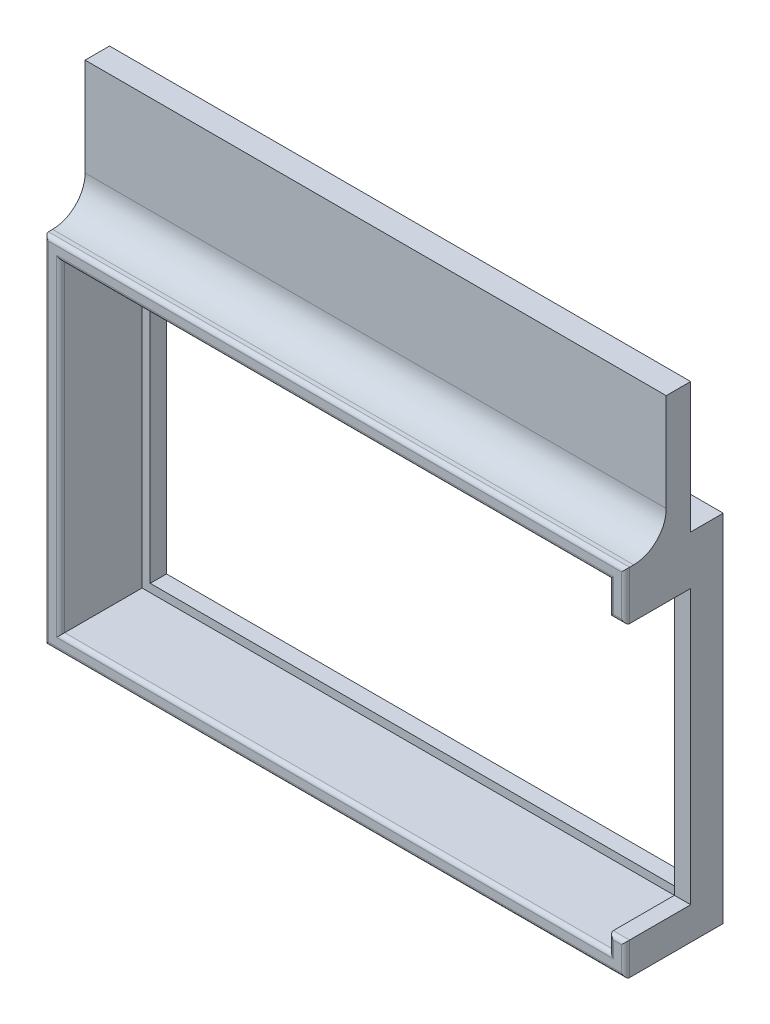
ISO-10303-21;
HEADER;
FILE_DESCRIPTION(('STEP AP214'),'2;1');
FILE_NAME('part.step','',(''),(''),'','','');
FILE_SCHEMA(('AUTOMOTIVE_DESIGN { 1 0 10303 214 1 1 1 1 }'));
ENDSEC;
DATA;
#1=APPLICATION_CONTEXT('core data for automotive mechanical design processes');
#2=APPLICATION_PROTOCOL_DEFINITION('international standard','automotive_design',2000,#1);
#3=PRODUCT_CONTEXT('',#1,'mechanical');
#4=PRODUCT('Part','Part','',(#3));
#5=PRODUCT_RELATED_PRODUCT_CATEGORY('part','',(#4));
#6=PRODUCT_DEFINITION_FORMATION('','',#4);
#7=PRODUCT_DEFINITION_CONTEXT('part definition',#1,'design');
#8=PRODUCT_DEFINITION('design','',#6,#7);
#9=PRODUCT_DEFINITION_SHAPE('','',#8);
#10=(LENGTH_UNIT() NAMED_UNIT(*) SI_UNIT(.MILLI.,.METRE.));
#11=(NAMED_UNIT(*) PLANE_ANGLE_UNIT() SI_UNIT($,.RADIAN.));
#12=(NAMED_UNIT(*) SI_UNIT($,.STERADIAN.) SOLID_ANGLE_UNIT());
#13=UNCERTAINTY_MEASURE_WITH_UNIT(LENGTH_MEASURE(1.E-05),#10,'distance_accuracy_value','');
#14=(GEOMETRIC_REPRESENTATION_CONTEXT(3) GLOBAL_UNCERTAINTY_ASSIGNED_CONTEXT((#13)) GLOBAL_UNIT_ASSIGNED_CONTEXT((#10,
#11,#12)) REPRESENTATION_CONTEXT('',''));
#15=CARTESIAN_POINT('',(0.,0.,0.));
#16=DIRECTION('',(0.,0.,1.));
#17=DIRECTION('',(1.,0.,0.));
#18=AXIS2_PLACEMENT_3D('',#15,#16,#17);
#19=CARTESIAN_POINT('',(0.,29.82,2.));
#20=DIRECTION('',(0.,1.,0.));
#21=DIRECTION('',(0.,0.,1.));
#22=AXIS2_PLACEMENT_3D('',#19,#20,#21);
#23=PLANE('',#22);
#24=DIRECTION('',(0.,0.,1.));
#25=VECTOR('',#24,1.);
#26=CARTESIAN_POINT('',(0.,29.82,2.));
#27=LINE('',#26,#25);
#28=CARTESIAN_POINT('',(0.,29.82,2.));
#29=VERTEX_POINT('',#28);
#30=CARTESIAN_POINT('',(0.,29.82,3.5));
#31=VERTEX_POINT('',#30);
#32=EDGE_CURVE('E226',#29,#31,#27,.T.);
#33=ORIENTED_EDGE('',*,*,#32,.T.);
#34=DIRECTION('',(-1.,0.,0.));
#35=VECTOR('',#34,1.);
#36=CARTESIAN_POINT('',(0.,29.82,3.5));
#37=LINE('',#36,#35);
#38=CARTESIAN_POINT('',(35.68,29.82,3.5));
#39=VERTEX_POINT('',#38);
#40=EDGE_CURVE('E210',#39,#31,#37,.T.);
#41=ORIENTED_EDGE('',*,*,#40,.F.);
#42=DIRECTION('',(0.,0.,1.));
#43=VECTOR('',#42,1.);
#44=CARTESIAN_POINT('',(35.68,29.82,2.));
#45=LINE('',#44,#43);
#46=CARTESIAN_POINT('',(35.68,29.82,2.));
#47=VERTEX_POINT('',#46);
#48=EDGE_CURVE('E235',#47,#39,#45,.T.);
#49=ORIENTED_EDGE('',*,*,#48,.F.);
#50=DIRECTION('',(-1.,0.,0.));
#51=VECTOR('',#50,1.);
#52=CARTESIAN_POINT('',(0.,29.82,2.));
#53=LINE('',#52,#51);
#54=EDGE_CURVE('E233',#47,#29,#53,.T.);
#55=ORIENTED_EDGE('',*,*,#54,.T.);
#56=EDGE_LOOP('',(#33,#41,#49,#55));
#57=FACE_BOUND('',#56,.T.);
#58=ADVANCED_FACE('F33',(#57),#23,.T.);
#59=CARTESIAN_POINT('',(0.,0.,1.));
#60=DIRECTION('',(0.,0.,-1.));
#61=DIRECTION('',(-1.,0.,0.));
#62=AXIS2_PLACEMENT_3D('',#59,#60,#61);
#63=PLANE('',#62);
#64=DIRECTION('',(0.,-1.,0.));
#65=VECTOR('',#64,1.);
#66=CARTESIAN_POINT('',(1.,1.,1.));
#67=LINE('',#66,#65);
#68=CARTESIAN_POINT('',(1.,20.82,1.));
#69=VERTEX_POINT('',#68);
#70=CARTESIAN_POINT('',(1.,1.,1.));
#71=VERTEX_POINT('',#70);
#72=EDGE_CURVE('E279',#69,#71,#67,.T.);
#73=ORIENTED_EDGE('',*,*,#72,.T.);
#74=DIRECTION('',(1.,0.,0.));
#75=VECTOR('',#74,1.);
#76=CARTESIAN_POINT('',(1.,1.,1.));
#77=LINE('',#76,#75);
#78=CARTESIAN_POINT('',(34.68,1.,1.));
#79=VERTEX_POINT('',#78);
#80=EDGE_CURVE('E288',#71,#79,#77,.T.);
#81=ORIENTED_EDGE('',*,*,#80,.T.);
#82=DIRECTION('',(0.,1.,0.));
#83=VECTOR('',#82,1.);
#84=CARTESIAN_POINT('',(34.68,1.,1.));
#85=LINE('',#84,#83);
#86=CARTESIAN_POINT('',(34.68,20.82,1.));
#87=VERTEX_POINT('',#86);
#88=EDGE_CURVE('E291',#79,#87,#85,.T.);
#89=ORIENTED_EDGE('',*,*,#88,.T.);
#90=DIRECTION('',(-1.,0.,0.));
#91=VECTOR('',#90,1.);
#92=CARTESIAN_POINT('',(1.,20.82,1.));
#93=LINE('',#92,#91);
#94=EDGE_CURVE('E294',#87,#69,#93,.T.);
#95=ORIENTED_EDGE('',*,*,#94,.T.);
#96=EDGE_LOOP('',(#73,#81,#89,#95));
#97=FACE_BOUND('',#96,.T.);
#98=DIRECTION('',(0.,-1.,0.));
#99=VECTOR('',#98,1.);
#100=CARTESIAN_POINT('',(1.5,1.5,1.));
#101=LINE('',#100,#99);
#102=CARTESIAN_POINT('',(1.5,20.32,1.));
#103=VERTEX_POINT('',#102);
#104=CARTESIAN_POINT('',(1.5,1.5,1.));
#105=VERTEX_POINT('',#104);
#106=EDGE_CURVE('E251',#103,#105,#101,.T.);
#107=ORIENTED_EDGE('',*,*,#106,.F.);
#108=DIRECTION('',(-1.,0.,0.));
#109=VECTOR('',#108,1.);
#110=CARTESIAN_POINT('',(1.5,20.32,1.));
#111=LINE('',#110,#109);
#112=CARTESIAN_POINT('',(34.18,20.32,1.));
#113=VERTEX_POINT('',#112);
#114=EDGE_CURVE('E258',#113,#103,#111,.T.);
#115=ORIENTED_EDGE('',*,*,#114,.F.);
#116=DIRECTION('',(0.,1.,0.));
#117=VECTOR('',#116,1.);
#118=CARTESIAN_POINT('',(34.18,1.5,1.));
#119=LINE('',#118,#117);
#120=CARTESIAN_POINT('',(34.18,1.5,1.));
#121=VERTEX_POINT('',#120);
#122=EDGE_CURVE('E273',#121,#113,#119,.T.);
#123=ORIENTED_EDGE('',*,*,#122,.F.);
#124=DIRECTION('',(1.,0.,0.));
#125=VECTOR('',#124,1.);
#126=CARTESIAN_POINT('',(1.5,1.5,1.));
#127=LINE('',#126,#125);
#128=EDGE_CURVE('E270',#105,#121,#127,.T.);
#129=ORIENTED_EDGE('',*,*,#128,.F.);
#130=EDGE_LOOP('',(#107,#115,#123,#129));
#131=FACE_BOUND('',#130,.T.);
#132=ADVANCED_FACE('F477',(#97,#131),#63,.F.);
#133=CARTESIAN_POINT('',(0.,0.,6.));
#134=DIRECTION('',(1.,0.,0.));
#135=DIRECTION('',(0.,0.,-1.));
#136=AXIS2_PLACEMENT_3D('',#133,#134,#135);
#137=PLANE('',#136);
#138=DIRECTION('',(0.,0.,-1.));
#139=VECTOR('',#138,1.);
#140=CARTESIAN_POINT('',(0.,0.,6.));
#141=LINE('',#140,#139);
#142=CARTESIAN_POINT('',(0.,0.,5.75));
#143=VERTEX_POINT('',#142);
#144=CARTESIAN_POINT('',(0.,0.,0.));
#145=VERTEX_POINT('',#144);
#146=EDGE_CURVE('E327',#143,#145,#141,.T.);
#147=ORIENTED_EDGE('',*,*,#146,.F.);
#148=DIRECTION('',(0.,-1.,0.));
#149=VECTOR('',#148,1.);
#150=CARTESIAN_POINT('',(0.,0.,5.75));
#151=LINE('',#150,#149);
#152=CARTESIAN_POINT('',(0.,21.82,5.75));
#153=VERTEX_POINT('',#152);
#154=EDGE_CURVE('E383',#143,#153,#151,.F.);
#155=ORIENTED_EDGE('',*,*,#154,.T.);
#156=DIRECTION('',(0.,0.,1.));
#157=VECTOR('',#156,1.);
#158=CARTESIAN_POINT('',(0.,21.82,3.5));
#159=LINE('',#158,#157);
#160=CARTESIAN_POINT('',(0.,21.82,5.5));
#161=VERTEX_POINT('',#160);
#162=EDGE_CURVE('E220',#161,#153,#159,.T.);
#163=ORIENTED_EDGE('',*,*,#162,.F.);
#164=CARTESIAN_POINT('',(0.,23.82,5.5));
#165=DIRECTION('',(1.,0.,0.));
#166=DIRECTION('',(0.,0.,-1.));
#167=AXIS2_PLACEMENT_3D('',#164,#165,#166);
#168=CIRCLE('',#167,2.);
#169=CARTESIAN_POINT('',(0.,23.82,3.5));
#170=VERTEX_POINT('',#169);
#171=EDGE_CURVE('E11',#161,#170,#168,.T.);
#172=ORIENTED_EDGE('',*,*,#171,.T.);
#173=DIRECTION('',(0.,-1.,0.));
#174=VECTOR('',#173,1.);
#175=CARTESIAN_POINT('',(0.,29.82,3.5));
#176=LINE('',#175,#174);
#177=EDGE_CURVE('E214',#31,#170,#176,.T.);
#178=ORIENTED_EDGE('',*,*,#177,.F.);
#179=ORIENTED_EDGE('',*,*,#32,.F.);
#180=DIRECTION('',(0.,-1.,0.));
#181=VECTOR('',#180,1.);
#182=CARTESIAN_POINT('',(0.,21.82,2.));
#183=LINE('',#182,#181);
#184=CARTESIAN_POINT('',(0.,21.82,2.));
#185=VERTEX_POINT('',#184);
#186=EDGE_CURVE('E432',#29,#185,#183,.T.);
#187=ORIENTED_EDGE('',*,*,#186,.T.);
#188=DIRECTION('',(0.,0.,-1.));
#189=VECTOR('',#188,1.);
#190=CARTESIAN_POINT('',(0.,21.82,6.));
#191=LINE('',#190,#189);
#192=CARTESIAN_POINT('',(0.,21.82,0.));
#193=VERTEX_POINT('',#192);
#194=EDGE_CURVE('E321',#185,#193,#191,.T.);
#195=ORIENTED_EDGE('',*,*,#194,.T.);
#196=DIRECTION('',(0.,-1.,0.));
#197=VECTOR('',#196,1.);
#198=CARTESIAN_POINT('',(0.,0.,0.));
#199=LINE('',#198,#197);
#200=EDGE_CURVE('E301',#193,#145,#199,.T.);
#201=ORIENTED_EDGE('',*,*,#200,.T.);
#202=EDGE_LOOP('',(#147,#155,#163,#172,#178,#179,#187,#195,#201));
#203=FACE_BOUND('',#202,.T.);
#204=ADVANCED_FACE('F224',(#203),#137,.F.);
#205=CARTESIAN_POINT('',(0.,0.,6.));
#206=DIRECTION('',(0.,1.,0.));
#207=DIRECTION('',(0.,0.,1.));
#208=AXIS2_PLACEMENT_3D('',#205,#206,#207);
#209=PLANE('',#208);
#210=DIRECTION('',(0.,0.,-1.));
#211=VECTOR('',#210,1.);
#212=CARTESIAN_POINT('',(35.68,0.,6.));
#213=LINE('',#212,#211);
#214=CARTESIAN_POINT('',(35.68,0.,5.75));
#215=VERTEX_POINT('',#214);
#216=CARTESIAN_POINT('',(35.68,0.,0.));
#217=VERTEX_POINT('',#216);
#218=EDGE_CURVE('E325',#215,#217,#213,.T.);
#219=ORIENTED_EDGE('',*,*,#218,.F.);
#220=DIRECTION('',(1.,0.,0.));
#221=VECTOR('',#220,1.);
#222=CARTESIAN_POINT('',(0.,0.,5.75));
#223=LINE('',#222,#221);
#224=EDGE_CURVE('E381',#215,#143,#223,.F.);
#225=ORIENTED_EDGE('',*,*,#224,.T.);
#226=ORIENTED_EDGE('',*,*,#146,.T.);
#227=DIRECTION('',(1.,0.,0.));
#228=VECTOR('',#227,1.);
#229=CARTESIAN_POINT('',(0.,0.,0.));
#230=LINE('',#229,#228);
#231=EDGE_CURVE('E312',#145,#217,#230,.T.);
#232=ORIENTED_EDGE('',*,*,#231,.T.);
#233=EDGE_LOOP('',(#219,#225,#226,#232));
#234=FACE_BOUND('',#233,.T.);
#235=ADVANCED_FACE('F544',(#234),#209,.F.);
#236=CARTESIAN_POINT('',(35.68,0.,6.));
#237=DIRECTION('',(-1.,0.,0.));
#238=DIRECTION('',(0.,0.,1.));
#239=AXIS2_PLACEMENT_3D('',#236,#237,#238);
#240=PLANE('',#239);
#241=DIRECTION('',(0.,0.,-1.));
#242=VECTOR('',#241,1.);
#243=CARTESIAN_POINT('',(35.68,2.,6.));
#244=LINE('',#243,#242);
#245=CARTESIAN_POINT('',(35.68,2.,5.75));
#246=VERTEX_POINT('',#245);
#247=CARTESIAN_POINT('',(35.68,2.,2.));
#248=VERTEX_POINT('',#247);
#249=EDGE_CURVE('E234',#246,#248,#244,.T.);
#250=ORIENTED_EDGE('',*,*,#249,.F.);
#251=DIRECTION('',(0.,1.,0.));
#252=VECTOR('',#251,1.);
#253=CARTESIAN_POINT('',(35.68,0.,5.75));
#254=LINE('',#253,#252);
#255=EDGE_CURVE('E379',#246,#215,#254,.F.);
#256=ORIENTED_EDGE('',*,*,#255,.T.);
#257=ORIENTED_EDGE('',*,*,#218,.T.);
#258=DIRECTION('',(0.,1.,0.));
#259=VECTOR('',#258,1.);
#260=CARTESIAN_POINT('',(35.68,0.,0.));
#261=LINE('',#260,#259);
#262=CARTESIAN_POINT('',(35.68,21.82,0.));
#263=VERTEX_POINT('',#262);
#264=EDGE_CURVE('E315',#217,#263,#261,.T.);
#265=ORIENTED_EDGE('',*,*,#264,.T.);
#266=DIRECTION('',(0.,0.,-1.));
#267=VECTOR('',#266,1.);
#268=CARTESIAN_POINT('',(35.68,21.82,6.));
#269=LINE('',#268,#267);
#270=CARTESIAN_POINT('',(35.68,21.82,2.));
#271=VERTEX_POINT('',#270);
#272=EDGE_CURVE('E323',#271,#263,#269,.T.);
#273=ORIENTED_EDGE('',*,*,#272,.F.);
#274=DIRECTION('',(0.,1.,0.));
#275=VECTOR('',#274,1.);
#276=CARTESIAN_POINT('',(35.68,21.82,2.));
#277=LINE('',#276,#275);
#278=EDGE_CURVE('E437',#271,#47,#277,.T.);
#279=ORIENTED_EDGE('',*,*,#278,.T.);
#280=ORIENTED_EDGE('',*,*,#48,.T.);
#281=DIRECTION('',(0.,1.,0.));
#282=VECTOR('',#281,1.);
#283=CARTESIAN_POINT('',(35.68,29.82,3.5));
#284=LINE('',#283,#282);
#285=CARTESIAN_POINT('',(35.68,23.82,3.5));
#286=VERTEX_POINT('',#285);
#287=EDGE_CURVE('E216',#286,#39,#284,.T.);
#288=ORIENTED_EDGE('',*,*,#287,.F.);
#289=CARTESIAN_POINT('',(35.68,23.82,5.5));
#290=DIRECTION('',(-1.,0.,0.));
#291=DIRECTION('',(0.,0.,1.));
#292=AXIS2_PLACEMENT_3D('',#289,#290,#291);
#293=CIRCLE('',#292,2.);
#294=CARTESIAN_POINT('',(35.68,21.82,5.5));
#295=VERTEX_POINT('',#294);
#296=EDGE_CURVE('E41',#286,#295,#293,.T.);
#297=ORIENTED_EDGE('',*,*,#296,.T.);
#298=DIRECTION('',(0.,0.,1.));
#299=VECTOR('',#298,1.);
#300=CARTESIAN_POINT('',(35.68,21.82,3.5));
#301=LINE('',#300,#299);
#302=CARTESIAN_POINT('',(35.68,21.82,5.75));
#303=VERTEX_POINT('',#302);
#304=EDGE_CURVE('E430',#295,#303,#301,.T.);
#305=ORIENTED_EDGE('',*,*,#304,.T.);
#306=DIRECTION('',(0.,1.,0.));
#307=VECTOR('',#306,1.);
#308=CARTESIAN_POINT('',(35.68,0.,5.75));
#309=LINE('',#308,#307);
#310=CARTESIAN_POINT('',(35.68,18.82,5.75));
#311=VERTEX_POINT('',#310);
#312=EDGE_CURVE('E377',#303,#311,#309,.F.);
#313=ORIENTED_EDGE('',*,*,#312,.T.);
#314=DIRECTION('',(0.,0.,1.));
#315=VECTOR('',#314,1.);
#316=CARTESIAN_POINT('',(35.68,18.82,6.));
#317=LINE('',#316,#315);
#318=CARTESIAN_POINT('',(35.68,18.82,2.));
#319=VERTEX_POINT('',#318);
#320=EDGE_CURVE('E245',#319,#311,#317,.T.);
#321=ORIENTED_EDGE('',*,*,#320,.F.);
#322=DIRECTION('',(0.,1.,0.));
#323=VECTOR('',#322,1.);
#324=CARTESIAN_POINT('',(35.68,18.82,2.));
#325=LINE('',#324,#323);
#326=EDGE_CURVE('E237',#248,#319,#325,.T.);
#327=ORIENTED_EDGE('',*,*,#326,.F.);
#328=EDGE_LOOP('',(#250,#256,#257,#265,#273,#279,#280,#288,#297,#305,#313,#321,#327));
#329=FACE_BOUND('',#328,.T.);
#330=ADVANCED_FACE('F426',(#329),#240,.F.);
#331=CARTESIAN_POINT('',(0.,21.82,6.));
#332=DIRECTION('',(0.,-1.,0.));
#333=DIRECTION('',(0.,0.,-1.));
#334=AXIS2_PLACEMENT_3D('',#331,#332,#333);
#335=PLANE('',#334);
#336=ORIENTED_EDGE('',*,*,#194,.F.);
#337=DIRECTION('',(1.,0.,0.));
#338=VECTOR('',#337,1.);
#339=CARTESIAN_POINT('',(0.,21.82,2.));
#340=LINE('',#339,#338);
#341=EDGE_CURVE('E435',#185,#271,#340,.T.);
#342=ORIENTED_EDGE('',*,*,#341,.T.);
#343=ORIENTED_EDGE('',*,*,#272,.T.);
#344=DIRECTION('',(-1.,0.,0.));
#345=VECTOR('',#344,1.);
#346=CARTESIAN_POINT('',(0.,21.82,0.));
#347=LINE('',#346,#345);
#348=EDGE_CURVE('E318',#263,#193,#347,.T.);
#349=ORIENTED_EDGE('',*,*,#348,.T.);
#350=EDGE_LOOP('',(#336,#342,#343,#349));
#351=FACE_BOUND('',#350,.T.);
#352=ADVANCED_FACE('F443',(#351),#335,.F.);
#353=CARTESIAN_POINT('',(0.,0.,6.));
#354=DIRECTION('',(0.,0.,-1.));
#355=DIRECTION('',(-1.,0.,0.));
#356=AXIS2_PLACEMENT_3D('',#353,#354,#355);
#357=PLANE('',#356);
#358=DIRECTION('',(0.,1.,0.));
#359=VECTOR('',#358,1.);
#360=CARTESIAN_POINT('',(34.93,0.,6.));
#361=LINE('',#360,#359);
#362=CARTESIAN_POINT('',(34.93,21.07,6.));
#363=VERTEX_POINT('',#362);
#364=CARTESIAN_POINT('',(34.93,19.07,6.));
#365=VERTEX_POINT('',#364);
#366=EDGE_CURVE('E357',#363,#365,#361,.F.);
#367=ORIENTED_EDGE('',*,*,#366,.T.);
#368=DIRECTION('',(1.,0.,0.));
#369=VECTOR('',#368,1.);
#370=CARTESIAN_POINT('',(0.,19.07,6.));
#371=LINE('',#370,#369);
#372=CARTESIAN_POINT('',(35.43,19.07,6.));
#373=VERTEX_POINT('',#372);
#374=EDGE_CURVE('E359',#365,#373,#371,.T.);
#375=ORIENTED_EDGE('',*,*,#374,.T.);
#376=DIRECTION('',(0.,1.,0.));
#377=VECTOR('',#376,1.);
#378=CARTESIAN_POINT('',(35.43,0.,6.));
#379=LINE('',#378,#377);
#380=CARTESIAN_POINT('',(35.43,21.57,6.));
#381=VERTEX_POINT('',#380);
#382=EDGE_CURVE('E337',#373,#381,#379,.T.);
#383=ORIENTED_EDGE('',*,*,#382,.T.);
#384=DIRECTION('',(1.,0.,0.));
#385=VECTOR('',#384,1.);
#386=CARTESIAN_POINT('',(0.,21.57,6.));
#387=LINE('',#386,#385);
#388=CARTESIAN_POINT('',(0.25,21.57,6.));
#389=VERTEX_POINT('',#388);
#390=EDGE_CURVE('E339',#381,#389,#387,.F.);
#391=ORIENTED_EDGE('',*,*,#390,.T.);
#392=DIRECTION('',(0.,-1.,0.));
#393=VECTOR('',#392,1.);
#394=CARTESIAN_POINT('',(0.25,0.,6.));
#395=LINE('',#394,#393);
#396=CARTESIAN_POINT('',(0.25,0.25,6.));
#397=VERTEX_POINT('',#396);
#398=EDGE_CURVE('E341',#389,#397,#395,.T.);
#399=ORIENTED_EDGE('',*,*,#398,.T.);
#400=DIRECTION('',(1.,0.,0.));
#401=VECTOR('',#400,1.);
#402=CARTESIAN_POINT('',(0.,0.25,6.));
#403=LINE('',#402,#401);
#404=CARTESIAN_POINT('',(35.43,0.25,6.));
#405=VERTEX_POINT('',#404);
#406=EDGE_CURVE('E343',#397,#405,#403,.T.);
#407=ORIENTED_EDGE('',*,*,#406,.T.);
#408=DIRECTION('',(0.,1.,0.));
#409=VECTOR('',#408,1.);
#410=CARTESIAN_POINT('',(35.43,0.,6.));
#411=LINE('',#410,#409);
#412=CARTESIAN_POINT('',(35.43,1.75,6.));
#413=VERTEX_POINT('',#412);
#414=EDGE_CURVE('E345',#405,#413,#411,.T.);
#415=ORIENTED_EDGE('',*,*,#414,.T.);
#416=DIRECTION('',(1.,0.,0.));
#417=VECTOR('',#416,1.);
#418=CARTESIAN_POINT('',(0.,1.75,6.));
#419=LINE('',#418,#417);
#420=CARTESIAN_POINT('',(34.93,1.75,6.));
#421=VERTEX_POINT('',#420);
#422=EDGE_CURVE('E347',#413,#421,#419,.F.);
#423=ORIENTED_EDGE('',*,*,#422,.T.);
#424=DIRECTION('',(0.,1.,0.));
#425=VECTOR('',#424,1.);
#426=CARTESIAN_POINT('',(34.93,0.,6.));
#427=LINE('',#426,#425);
#428=CARTESIAN_POINT('',(34.93,0.75,6.));
#429=VERTEX_POINT('',#428);
#430=EDGE_CURVE('E349',#421,#429,#427,.F.);
#431=ORIENTED_EDGE('',*,*,#430,.T.);
#432=DIRECTION('',(1.,0.,0.));
#433=VECTOR('',#432,1.);
#434=CARTESIAN_POINT('',(0.,0.75,6.));
#435=LINE('',#434,#433);
#436=CARTESIAN_POINT('',(0.75,0.75,6.));
#437=VERTEX_POINT('',#436);
#438=EDGE_CURVE('E351',#429,#437,#435,.F.);
#439=ORIENTED_EDGE('',*,*,#438,.T.);
#440=DIRECTION('',(0.,-1.,0.));
#441=VECTOR('',#440,1.);
#442=CARTESIAN_POINT('',(0.75,0.,6.));
#443=LINE('',#442,#441);
#444=CARTESIAN_POINT('',(0.75,21.07,6.));
#445=VERTEX_POINT('',#444);
#446=EDGE_CURVE('E353',#437,#445,#443,.F.);
#447=ORIENTED_EDGE('',*,*,#446,.T.);
#448=DIRECTION('',(-1.,0.,0.));
#449=VECTOR('',#448,1.);
#450=CARTESIAN_POINT('',(0.,21.07,6.));
#451=LINE('',#450,#449);
#452=EDGE_CURVE('E355',#445,#363,#451,.F.);
#453=ORIENTED_EDGE('',*,*,#452,.T.);
#454=EDGE_LOOP('',(#367,#375,#383,#391,#399,#407,#415,#423,#431,#439,#447,#453));
#455=FACE_BOUND('',#454,.T.);
#456=ADVANCED_FACE('F533',(#455),#357,.F.);
#457=CARTESIAN_POINT('',(0.,0.,0.));
#458=DIRECTION('',(0.,0.,-1.));
#459=DIRECTION('',(-1.,0.,0.));
#460=AXIS2_PLACEMENT_3D('',#457,#458,#459);
#461=PLANE('',#460);
#462=DIRECTION('',(0.,-1.,0.));
#463=VECTOR('',#462,1.);
#464=CARTESIAN_POINT('',(1.5,1.5,0.));
#465=LINE('',#464,#463);
#466=CARTESIAN_POINT('',(1.5,20.32,0.));
#467=VERTEX_POINT('',#466);
#468=CARTESIAN_POINT('',(1.5,1.5,0.));
#469=VERTEX_POINT('',#468);
#470=EDGE_CURVE('E254',#467,#469,#465,.T.);
#471=ORIENTED_EDGE('',*,*,#470,.T.);
#472=DIRECTION('',(1.,0.,0.));
#473=VECTOR('',#472,1.);
#474=CARTESIAN_POINT('',(1.5,1.5,0.));
#475=LINE('',#474,#473);
#476=CARTESIAN_POINT('',(34.18,1.5,0.));
#477=VERTEX_POINT('',#476);
#478=EDGE_CURVE('E257',#469,#477,#475,.T.);
#479=ORIENTED_EDGE('',*,*,#478,.T.);
#480=DIRECTION('',(0.,1.,0.));
#481=VECTOR('',#480,1.);
#482=CARTESIAN_POINT('',(34.18,1.5,0.));
#483=LINE('',#482,#481);
#484=CARTESIAN_POINT('',(34.18,20.32,0.));
#485=VERTEX_POINT('',#484);
#486=EDGE_CURVE('E261',#477,#485,#483,.T.);
#487=ORIENTED_EDGE('',*,*,#486,.T.);
#488=DIRECTION('',(-1.,0.,0.));
#489=VECTOR('',#488,1.);
#490=CARTESIAN_POINT('',(1.5,20.32,0.));
#491=LINE('',#490,#489);
#492=EDGE_CURVE('E264',#485,#467,#491,.T.);
#493=ORIENTED_EDGE('',*,*,#492,.T.);
#494=EDGE_LOOP('',(#471,#479,#487,#493));
#495=FACE_BOUND('',#494,.T.);
#496=ORIENTED_EDGE('',*,*,#200,.F.);
#497=ORIENTED_EDGE('',*,*,#348,.F.);
#498=ORIENTED_EDGE('',*,*,#264,.F.);
#499=ORIENTED_EDGE('',*,*,#231,.F.);
#500=EDGE_LOOP('',(#496,#497,#498,#499));
#501=FACE_BOUND('',#500,.T.);
#502=ADVANCED_FACE('F449',(#495,#501),#461,.T.);
#503=CARTESIAN_POINT('',(1.,1.,1.));
#504=DIRECTION('',(-1.,0.,0.));
#505=DIRECTION('',(0.,0.,1.));
#506=AXIS2_PLACEMENT_3D('',#503,#504,#505);
#507=PLANE('',#506);
#508=DIRECTION('',(0.,0.,1.));
#509=VECTOR('',#508,1.);
#510=CARTESIAN_POINT('',(1.,20.82,1.));
#511=LINE('',#510,#509);
#512=CARTESIAN_POINT('',(1.,20.82,5.75));
#513=VERTEX_POINT('',#512);
#514=EDGE_CURVE('E298',#69,#513,#511,.T.);
#515=ORIENTED_EDGE('',*,*,#514,.T.);
#516=DIRECTION('',(0.,-1.,0.));
#517=VECTOR('',#516,1.);
#518=CARTESIAN_POINT('',(1.,1.,5.75));
#519=LINE('',#518,#517);
#520=CARTESIAN_POINT('',(1.,1.,5.75));
#521=VERTEX_POINT('',#520);
#522=EDGE_CURVE('E371',#513,#521,#519,.T.);
#523=ORIENTED_EDGE('',*,*,#522,.T.);
#524=DIRECTION('',(0.,0.,1.));
#525=VECTOR('',#524,1.);
#526=CARTESIAN_POINT('',(1.,1.,1.));
#527=LINE('',#526,#525);
#528=EDGE_CURVE('E297',#71,#521,#527,.T.);
#529=ORIENTED_EDGE('',*,*,#528,.F.);
#530=ORIENTED_EDGE('',*,*,#72,.F.);
#531=EDGE_LOOP('',(#515,#523,#529,#530));
#532=FACE_BOUND('',#531,.T.);
#533=ADVANCED_FACE('F522',(#532),#507,.F.);
#534=CARTESIAN_POINT('',(1.,20.82,1.));
#535=DIRECTION('',(0.,1.,0.));
#536=DIRECTION('',(0.,0.,1.));
#537=AXIS2_PLACEMENT_3D('',#534,#535,#536);
#538=PLANE('',#537);
#539=DIRECTION('',(0.,0.,1.));
#540=VECTOR('',#539,1.);
#541=CARTESIAN_POINT('',(34.68,20.82,1.));
#542=LINE('',#541,#540);
#543=CARTESIAN_POINT('',(34.68,20.82,5.75));
#544=VERTEX_POINT('',#543);
#545=EDGE_CURVE('E302',#87,#544,#542,.T.);
#546=ORIENTED_EDGE('',*,*,#545,.T.);
#547=DIRECTION('',(-1.,0.,0.));
#548=VECTOR('',#547,1.);
#549=CARTESIAN_POINT('',(1.,20.82,5.75));
#550=LINE('',#549,#548);
#551=EDGE_CURVE('E369',#544,#513,#550,.T.);
#552=ORIENTED_EDGE('',*,*,#551,.T.);
#553=ORIENTED_EDGE('',*,*,#514,.F.);
#554=ORIENTED_EDGE('',*,*,#94,.F.);
#555=EDGE_LOOP('',(#546,#552,#553,#554));
#556=FACE_BOUND('',#555,.T.);
#557=ADVANCED_FACE('F518',(#556),#538,.F.);
#558=CARTESIAN_POINT('',(34.68,1.,1.));
#559=DIRECTION('',(1.,0.,0.));
#560=DIRECTION('',(0.,0.,-1.));
#561=AXIS2_PLACEMENT_3D('',#558,#559,#560);
#562=PLANE('',#561);
#563=DIRECTION('',(0.,0.,1.));
#564=VECTOR('',#563,1.);
#565=CARTESIAN_POINT('',(34.68,18.82,1.));
#566=LINE('',#565,#564);
#567=CARTESIAN_POINT('',(34.68,18.82,2.));
#568=VERTEX_POINT('',#567);
#569=CARTESIAN_POINT('',(34.68,18.82,5.75));
#570=VERTEX_POINT('',#569);
#571=EDGE_CURVE('E334',#568,#570,#566,.T.);
#572=ORIENTED_EDGE('',*,*,#571,.T.);
#573=DIRECTION('',(0.,1.,0.));
#574=VECTOR('',#573,1.);
#575=CARTESIAN_POINT('',(34.68,1.,5.75));
#576=LINE('',#575,#574);
#577=EDGE_CURVE('E367',#570,#544,#576,.T.);
#578=ORIENTED_EDGE('',*,*,#577,.T.);
#579=ORIENTED_EDGE('',*,*,#545,.F.);
#580=ORIENTED_EDGE('',*,*,#88,.F.);
#581=DIRECTION('',(0.,0.,1.));
#582=VECTOR('',#581,1.);
#583=CARTESIAN_POINT('',(34.68,1.,1.));
#584=LINE('',#583,#582);
#585=CARTESIAN_POINT('',(34.68,1.,5.75));
#586=VERTEX_POINT('',#585);
#587=EDGE_CURVE('E305',#79,#586,#584,.T.);
#588=ORIENTED_EDGE('',*,*,#587,.T.);
#589=DIRECTION('',(0.,1.,0.));
#590=VECTOR('',#589,1.);
#591=CARTESIAN_POINT('',(34.68,1.,5.75));
#592=LINE('',#591,#590);
#593=CARTESIAN_POINT('',(34.68,2.,5.75));
#594=VERTEX_POINT('',#593);
#595=EDGE_CURVE('E365',#586,#594,#592,.T.);
#596=ORIENTED_EDGE('',*,*,#595,.T.);
#597=DIRECTION('',(0.,0.,-1.));
#598=VECTOR('',#597,1.);
#599=CARTESIAN_POINT('',(34.68,2.,1.));
#600=LINE('',#599,#598);
#601=CARTESIAN_POINT('',(34.68,2.,2.));
#602=VERTEX_POINT('',#601);
#603=EDGE_CURVE('E329',#594,#602,#600,.T.);
#604=ORIENTED_EDGE('',*,*,#603,.T.);
#605=DIRECTION('',(0.,1.,0.));
#606=VECTOR('',#605,1.);
#607=CARTESIAN_POINT('',(34.68,1.,2.));
#608=LINE('',#607,#606);
#609=EDGE_CURVE('E331',#602,#568,#608,.T.);
#610=ORIENTED_EDGE('',*,*,#609,.T.);
#611=EDGE_LOOP('',(#572,#578,#579,#580,#588,#596,#604,#610));
#612=FACE_BOUND('',#611,.T.);
#613=ADVANCED_FACE('F521',(#612),#562,.F.);
#614=CARTESIAN_POINT('',(1.,1.,1.));
#615=DIRECTION('',(0.,-1.,0.));
#616=DIRECTION('',(0.,0.,-1.));
#617=AXIS2_PLACEMENT_3D('',#614,#615,#616);
#618=PLANE('',#617);
#619=ORIENTED_EDGE('',*,*,#528,.T.);
#620=DIRECTION('',(1.,0.,0.));
#621=VECTOR('',#620,1.);
#622=CARTESIAN_POINT('',(1.,1.,5.75));
#623=LINE('',#622,#621);
#624=EDGE_CURVE('E373',#521,#586,#623,.T.);
#625=ORIENTED_EDGE('',*,*,#624,.T.);
#626=ORIENTED_EDGE('',*,*,#587,.F.);
#627=ORIENTED_EDGE('',*,*,#80,.F.);
#628=EDGE_LOOP('',(#619,#625,#626,#627));
#629=FACE_BOUND('',#628,.T.);
#630=ADVANCED_FACE('F515',(#629),#618,.F.);
#631=CARTESIAN_POINT('',(1.5,1.5,0.));
#632=DIRECTION('',(-1.,0.,0.));
#633=DIRECTION('',(0.,0.,1.));
#634=AXIS2_PLACEMENT_3D('',#631,#632,#633);
#635=PLANE('',#634);
#636=ORIENTED_EDGE('',*,*,#106,.T.);
#637=DIRECTION('',(0.,0.,1.));
#638=VECTOR('',#637,1.);
#639=CARTESIAN_POINT('',(1.5,1.5,0.));
#640=LINE('',#639,#638);
#641=EDGE_CURVE('E267',#469,#105,#640,.T.);
#642=ORIENTED_EDGE('',*,*,#641,.F.);
#643=ORIENTED_EDGE('',*,*,#470,.F.);
#644=DIRECTION('',(0.,0.,1.));
#645=VECTOR('',#644,1.);
#646=CARTESIAN_POINT('',(1.5,20.32,0.));
#647=LINE('',#646,#645);
#648=EDGE_CURVE('E277',#467,#103,#647,.T.);
#649=ORIENTED_EDGE('',*,*,#648,.T.);
#650=EDGE_LOOP('',(#636,#642,#643,#649));
#651=FACE_BOUND('',#650,.T.);
#652=ADVANCED_FACE('F506',(#651),#635,.F.);
#653=CARTESIAN_POINT('',(1.5,20.32,0.));
#654=DIRECTION('',(0.,1.,0.));
#655=DIRECTION('',(0.,0.,1.));
#656=AXIS2_PLACEMENT_3D('',#653,#654,#655);
#657=PLANE('',#656);
#658=ORIENTED_EDGE('',*,*,#114,.T.);
#659=ORIENTED_EDGE('',*,*,#648,.F.);
#660=ORIENTED_EDGE('',*,*,#492,.F.);
#661=DIRECTION('',(0.,0.,1.));
#662=VECTOR('',#661,1.);
#663=CARTESIAN_POINT('',(34.18,20.32,0.));
#664=LINE('',#663,#662);
#665=EDGE_CURVE('E280',#485,#113,#664,.T.);
#666=ORIENTED_EDGE('',*,*,#665,.T.);
#667=EDGE_LOOP('',(#658,#659,#660,#666));
#668=FACE_BOUND('',#667,.T.);
#669=ADVANCED_FACE('F502',(#668),#657,.F.);
#670=CARTESIAN_POINT('',(34.18,1.5,0.));
#671=DIRECTION('',(1.,0.,0.));
#672=DIRECTION('',(0.,0.,-1.));
#673=AXIS2_PLACEMENT_3D('',#670,#671,#672);
#674=PLANE('',#673);
#675=ORIENTED_EDGE('',*,*,#122,.T.);
#676=ORIENTED_EDGE('',*,*,#665,.F.);
#677=ORIENTED_EDGE('',*,*,#486,.F.);
#678=DIRECTION('',(0.,0.,1.));
#679=VECTOR('',#678,1.);
#680=CARTESIAN_POINT('',(34.18,1.5,0.));
#681=LINE('',#680,#679);
#682=EDGE_CURVE('E283',#477,#121,#681,.T.);
#683=ORIENTED_EDGE('',*,*,#682,.T.);
#684=EDGE_LOOP('',(#675,#676,#677,#683));
#685=FACE_BOUND('',#684,.T.);
#686=ADVANCED_FACE('F505',(#685),#674,.F.);
#687=CARTESIAN_POINT('',(1.5,1.5,0.));
#688=DIRECTION('',(0.,-1.,0.));
#689=DIRECTION('',(0.,0.,-1.));
#690=AXIS2_PLACEMENT_3D('',#687,#688,#689);
#691=PLANE('',#690);
#692=ORIENTED_EDGE('',*,*,#128,.T.);
#693=ORIENTED_EDGE('',*,*,#682,.F.);
#694=ORIENTED_EDGE('',*,*,#478,.F.);
#695=ORIENTED_EDGE('',*,*,#641,.T.);
#696=EDGE_LOOP('',(#692,#693,#694,#695));
#697=FACE_BOUND('',#696,.T.);
#698=ADVANCED_FACE('F493',(#697),#691,.F.);
#699=CARTESIAN_POINT('',(30.68,18.82,6.));
#700=DIRECTION('',(0.,1.,0.));
#701=DIRECTION('',(0.,0.,1.));
#702=AXIS2_PLACEMENT_3D('',#699,#700,#701);
#703=PLANE('',#702);
#704=ORIENTED_EDGE('',*,*,#320,.T.);
#705=DIRECTION('',(1.,0.,0.));
#706=VECTOR('',#705,1.);
#707=CARTESIAN_POINT('',(30.68,18.82,5.75));
#708=LINE('',#707,#706);
#709=EDGE_CURVE('E362',#311,#570,#708,.F.);
#710=ORIENTED_EDGE('',*,*,#709,.T.);
#711=ORIENTED_EDGE('',*,*,#571,.F.);
#712=DIRECTION('',(1.,0.,0.));
#713=VECTOR('',#712,1.);
#714=CARTESIAN_POINT('',(30.68,18.82,2.));
#715=LINE('',#714,#713);
#716=EDGE_CURVE('E249',#568,#319,#715,.T.);
#717=ORIENTED_EDGE('',*,*,#716,.T.);
#718=EDGE_LOOP('',(#704,#710,#711,#717));
#719=FACE_BOUND('',#718,.T.);
#720=ADVANCED_FACE('F489',(#719),#703,.F.);
#721=CARTESIAN_POINT('',(30.68,18.82,2.));
#722=DIRECTION('',(0.,0.,-1.));
#723=DIRECTION('',(0.,1.,0.));
#724=AXIS2_PLACEMENT_3D('',#721,#722,#723);
#725=PLANE('',#724);
#726=DIRECTION('',(1.,0.,0.));
#727=VECTOR('',#726,1.);
#728=CARTESIAN_POINT('',(30.68,2.,2.));
#729=LINE('',#728,#727);
#730=EDGE_CURVE('E248',#602,#248,#729,.T.);
#731=ORIENTED_EDGE('',*,*,#730,.T.);
#732=ORIENTED_EDGE('',*,*,#326,.T.);
#733=ORIENTED_EDGE('',*,*,#716,.F.);
#734=ORIENTED_EDGE('',*,*,#609,.F.);
#735=EDGE_LOOP('',(#731,#732,#733,#734));
#736=FACE_BOUND('',#735,.T.);
#737=ADVANCED_FACE('F492',(#736),#725,.F.);
#738=CARTESIAN_POINT('',(30.68,2.,6.));
#739=DIRECTION('',(0.,-1.,0.));
#740=DIRECTION('',(0.,0.,-1.));
#741=AXIS2_PLACEMENT_3D('',#738,#739,#740);
#742=PLANE('',#741);
#743=ORIENTED_EDGE('',*,*,#603,.F.);
#744=DIRECTION('',(1.,0.,0.));
#745=VECTOR('',#744,1.);
#746=CARTESIAN_POINT('',(30.68,2.,5.75));
#747=LINE('',#746,#745);
#748=EDGE_CURVE('E375',#594,#246,#747,.T.);
#749=ORIENTED_EDGE('',*,*,#748,.T.);
#750=ORIENTED_EDGE('',*,*,#249,.T.);
#751=ORIENTED_EDGE('',*,*,#730,.F.);
#752=EDGE_LOOP('',(#743,#749,#750,#751));
#753=FACE_BOUND('',#752,.T.);
#754=ADVANCED_FACE('F497',(#753),#742,.F.);
#755=CARTESIAN_POINT('',(0.,0.,2.));
#756=DIRECTION('',(0.,0.,-1.));
#757=DIRECTION('',(-1.,0.,0.));
#758=AXIS2_PLACEMENT_3D('',#755,#756,#757);
#759=PLANE('',#758);
#760=ORIENTED_EDGE('',*,*,#186,.F.);
#761=ORIENTED_EDGE('',*,*,#54,.F.);
#762=ORIENTED_EDGE('',*,*,#278,.F.);
#763=ORIENTED_EDGE('',*,*,#341,.F.);
#764=EDGE_LOOP('',(#760,#761,#762,#763));
#765=FACE_BOUND('',#764,.T.);
#766=ADVANCED_FACE('F440',(#765),#759,.T.);
#767=CARTESIAN_POINT('',(0.,21.82,3.5));
#768=DIRECTION('',(0.,-1.,0.));
#769=DIRECTION('',(0.,0.,-1.));
#770=AXIS2_PLACEMENT_3D('',#767,#768,#769);
#771=PLANE('',#770);
#772=ORIENTED_EDGE('',*,*,#304,.F.);
#773=DIRECTION('',(1.,0.,0.));
#774=VECTOR('',#773,1.);
#775=CARTESIAN_POINT('',(0.,21.82,5.5));
#776=LINE('',#775,#774);
#777=EDGE_CURVE('E54',#295,#161,#776,.F.);
#778=ORIENTED_EDGE('',*,*,#777,.T.);
#779=ORIENTED_EDGE('',*,*,#162,.T.);
#780=DIRECTION('',(1.,0.,0.));
#781=VECTOR('',#780,1.);
#782=CARTESIAN_POINT('',(0.,21.82,5.75));
#783=LINE('',#782,#781);
#784=EDGE_CURVE('E386',#153,#303,#783,.T.);
#785=ORIENTED_EDGE('',*,*,#784,.T.);
#786=EDGE_LOOP('',(#772,#778,#779,#785));
#787=FACE_BOUND('',#786,.T.);
#788=ADVANCED_FACE('F467',(#787),#771,.F.);
#789=CARTESIAN_POINT('',(0.,0.,3.5));
#790=DIRECTION('',(0.,0.,1.));
#791=DIRECTION('',(1.,0.,0.));
#792=AXIS2_PLACEMENT_3D('',#789,#790,#791);
#793=PLANE('',#792);
#794=ORIENTED_EDGE('',*,*,#177,.T.);
#795=DIRECTION('',(1.,0.,0.));
#796=VECTOR('',#795,1.);
#797=CARTESIAN_POINT('',(0.,23.82,3.5));
#798=LINE('',#797,#796);
#799=EDGE_CURVE('E389',#170,#286,#798,.T.);
#800=ORIENTED_EDGE('',*,*,#799,.T.);
#801=ORIENTED_EDGE('',*,*,#287,.T.);
#802=ORIENTED_EDGE('',*,*,#40,.T.);
#803=EDGE_LOOP('',(#794,#800,#801,#802));
#804=FACE_BOUND('',#803,.T.);
#805=ADVANCED_FACE('F212',(#804),#793,.T.);
#806=CARTESIAN_POINT('',(30.68,1.75,5.75));
#807=DIRECTION('',(1.,0.,0.));
#808=DIRECTION('',(0.,0.,-1.));
#809=AXIS2_PLACEMENT_3D('',#806,#807,#808);
#810=CYLINDRICAL_SURFACE('',#809,0.25);
#811=CARTESIAN_POINT('',(35.43,1.75,5.75));
#812=DIRECTION('',(-0.707106781186547,0.707106781186547,0.));
#813=DIRECTION('',(0.707106781186547,0.707106781186547,0.));
#814=AXIS2_PLACEMENT_3D('',#811,#812,#813);
#815=ELLIPSE('',#814,0.353553390593274,0.25);
#816=EDGE_CURVE('E418',#246,#413,#815,.F.);
#817=ORIENTED_EDGE('',*,*,#816,.F.);
#818=ORIENTED_EDGE('',*,*,#748,.F.);
#819=CARTESIAN_POINT('',(34.93,1.75,5.75));
#820=DIRECTION('',(0.707106781186547,0.707106781186547,0.));
#821=DIRECTION('',(0.707106781186547,-0.707106781186547,0.));
#822=AXIS2_PLACEMENT_3D('',#819,#820,#821);
#823=ELLIPSE('',#822,0.353553390593274,0.25);
#824=EDGE_CURVE('E229',#421,#594,#823,.F.);
#825=ORIENTED_EDGE('',*,*,#824,.F.);
#826=ORIENTED_EDGE('',*,*,#422,.F.);
#827=EDGE_LOOP('',(#817,#818,#825,#826));
#828=FACE_BOUND('',#827,.T.);
#829=ADVANCED_FACE('F580',(#828),#810,.T.);
#830=CARTESIAN_POINT('',(34.93,1.,5.75));
#831=DIRECTION('',(0.,1.,0.));
#832=DIRECTION('',(0.,0.,1.));
#833=AXIS2_PLACEMENT_3D('',#830,#831,#832);
#834=CYLINDRICAL_SURFACE('',#833,0.25);
#835=ORIENTED_EDGE('',*,*,#824,.T.);
#836=ORIENTED_EDGE('',*,*,#595,.F.);
#837=CARTESIAN_POINT('',(34.93,0.75,5.75));
#838=DIRECTION('',(0.707106781186547,0.707106781186547,0.));
#839=DIRECTION('',(0.707106781186547,-0.707106781186547,0.));
#840=AXIS2_PLACEMENT_3D('',#837,#838,#839);
#841=ELLIPSE('',#840,0.353553390593274,0.25);
#842=EDGE_CURVE('E415',#429,#586,#841,.F.);
#843=ORIENTED_EDGE('',*,*,#842,.F.);
#844=ORIENTED_EDGE('',*,*,#430,.F.);
#845=EDGE_LOOP('',(#835,#836,#843,#844));
#846=FACE_BOUND('',#845,.T.);
#847=ADVANCED_FACE('F577',(#846),#834,.T.);
#848=CARTESIAN_POINT('',(35.43,0.,5.75));
#849=DIRECTION('',(0.,1.,0.));
#850=DIRECTION('',(0.,0.,1.));
#851=AXIS2_PLACEMENT_3D('',#848,#849,#850);
#852=CYLINDRICAL_SURFACE('',#851,0.25);
#853=ORIENTED_EDGE('',*,*,#816,.T.);
#854=ORIENTED_EDGE('',*,*,#414,.F.);
#855=CARTESIAN_POINT('',(35.43,0.25,5.75));
#856=DIRECTION('',(0.707106781186547,0.707106781186547,0.));
#857=DIRECTION('',(0.707106781186547,-0.707106781186547,0.));
#858=AXIS2_PLACEMENT_3D('',#855,#856,#857);
#859=ELLIPSE('',#858,0.353553390593274,0.25);
#860=EDGE_CURVE('E412',#215,#405,#859,.F.);
#861=ORIENTED_EDGE('',*,*,#860,.F.);
#862=ORIENTED_EDGE('',*,*,#255,.F.);
#863=EDGE_LOOP('',(#853,#854,#861,#862));
#864=FACE_BOUND('',#863,.T.);
#865=ADVANCED_FACE('F573',(#864),#852,.T.);
#866=CARTESIAN_POINT('',(1.,0.75,5.75));
#867=DIRECTION('',(1.,0.,0.));
#868=DIRECTION('',(0.,0.,-1.));
#869=AXIS2_PLACEMENT_3D('',#866,#867,#868);
#870=CYLINDRICAL_SURFACE('',#869,0.25);
#871=ORIENTED_EDGE('',*,*,#842,.T.);
#872=ORIENTED_EDGE('',*,*,#624,.F.);
#873=CARTESIAN_POINT('',(0.75,0.75,5.75));
#874=DIRECTION('',(0.707106781186547,-0.707106781186547,0.));
#875=DIRECTION('',(-0.707106781186547,-0.707106781186547,0.));
#876=AXIS2_PLACEMENT_3D('',#873,#874,#875);
#877=ELLIPSE('',#876,0.353553390593274,0.25);
#878=EDGE_CURVE('E409',#437,#521,#877,.F.);
#879=ORIENTED_EDGE('',*,*,#878,.F.);
#880=ORIENTED_EDGE('',*,*,#438,.F.);
#881=EDGE_LOOP('',(#871,#872,#879,#880));
#882=FACE_BOUND('',#881,.T.);
#883=ADVANCED_FACE('F570',(#882),#870,.T.);
#884=CARTESIAN_POINT('',(0.,0.25,5.75));
#885=DIRECTION('',(1.,0.,0.));
#886=DIRECTION('',(0.,0.,-1.));
#887=AXIS2_PLACEMENT_3D('',#884,#885,#886);
#888=CYLINDRICAL_SURFACE('',#887,0.25);
#889=ORIENTED_EDGE('',*,*,#860,.T.);
#890=ORIENTED_EDGE('',*,*,#406,.F.);
#891=CARTESIAN_POINT('',(0.25,0.25,5.75));
#892=DIRECTION('',(0.707106781186547,-0.707106781186547,0.));
#893=DIRECTION('',(-0.707106781186547,-0.707106781186547,0.));
#894=AXIS2_PLACEMENT_3D('',#891,#892,#893);
#895=ELLIPSE('',#894,0.353553390593274,0.25);
#896=EDGE_CURVE('E406',#143,#397,#895,.F.);
#897=ORIENTED_EDGE('',*,*,#896,.F.);
#898=ORIENTED_EDGE('',*,*,#224,.F.);
#899=EDGE_LOOP('',(#889,#890,#897,#898));
#900=FACE_BOUND('',#899,.T.);
#901=ADVANCED_FACE('F457',(#900),#888,.T.);
#902=CARTESIAN_POINT('',(0.75,1.,5.75));
#903=DIRECTION('',(0.,-1.,0.));
#904=DIRECTION('',(0.,0.,-1.));
#905=AXIS2_PLACEMENT_3D('',#902,#903,#904);
#906=CYLINDRICAL_SURFACE('',#905,0.25);
#907=ORIENTED_EDGE('',*,*,#878,.T.);
#908=ORIENTED_EDGE('',*,*,#522,.F.);
#909=CARTESIAN_POINT('',(0.75,21.07,5.75));
#910=DIRECTION('',(-0.707106781186547,-0.707106781186547,0.));
#911=DIRECTION('',(-0.707106781186547,0.707106781186547,0.));
#912=AXIS2_PLACEMENT_3D('',#909,#910,#911);
#913=ELLIPSE('',#912,0.353553390593274,0.25);
#914=EDGE_CURVE('E403',#445,#513,#913,.F.);
#915=ORIENTED_EDGE('',*,*,#914,.F.);
#916=ORIENTED_EDGE('',*,*,#446,.F.);
#917=EDGE_LOOP('',(#907,#908,#915,#916));
#918=FACE_BOUND('',#917,.T.);
#919=ADVANCED_FACE('F564',(#918),#906,.T.);
#920=CARTESIAN_POINT('',(0.25,0.,5.75));
#921=DIRECTION('',(0.,-1.,0.));
#922=DIRECTION('',(0.,0.,-1.));
#923=AXIS2_PLACEMENT_3D('',#920,#921,#922);
#924=CYLINDRICAL_SURFACE('',#923,0.25);
#925=ORIENTED_EDGE('',*,*,#896,.T.);
#926=ORIENTED_EDGE('',*,*,#398,.F.);
#927=CARTESIAN_POINT('',(0.25,21.57,5.75));
#928=DIRECTION('',(0.707106781186547,0.707106781186547,0.));
#929=DIRECTION('',(0.707106781186547,-0.707106781186547,0.));
#930=AXIS2_PLACEMENT_3D('',#927,#928,#929);
#931=ELLIPSE('',#930,0.353553390593274,0.25);
#932=EDGE_CURVE('E400',#153,#389,#931,.T.);
#933=ORIENTED_EDGE('',*,*,#932,.F.);
#934=ORIENTED_EDGE('',*,*,#154,.F.);
#935=EDGE_LOOP('',(#925,#926,#933,#934));
#936=FACE_BOUND('',#935,.T.);
#937=ADVANCED_FACE('F460',(#936),#924,.T.);
#938=CARTESIAN_POINT('',(1.,21.07,5.75));
#939=DIRECTION('',(-1.,0.,0.));
#940=DIRECTION('',(0.,0.,1.));
#941=AXIS2_PLACEMENT_3D('',#938,#939,#940);
#942=CYLINDRICAL_SURFACE('',#941,0.25);
#943=ORIENTED_EDGE('',*,*,#914,.T.);
#944=ORIENTED_EDGE('',*,*,#551,.F.);
#945=CARTESIAN_POINT('',(34.93,21.07,5.75));
#946=DIRECTION('',(-0.707106781186547,0.707106781186547,0.));
#947=DIRECTION('',(0.707106781186547,0.707106781186547,0.));
#948=AXIS2_PLACEMENT_3D('',#945,#946,#947);
#949=ELLIPSE('',#948,0.353553390593274,0.25);
#950=EDGE_CURVE('E397',#363,#544,#949,.F.);
#951=ORIENTED_EDGE('',*,*,#950,.F.);
#952=ORIENTED_EDGE('',*,*,#452,.F.);
#953=EDGE_LOOP('',(#943,#944,#951,#952));
#954=FACE_BOUND('',#953,.T.);
#955=ADVANCED_FACE('F558',(#954),#942,.T.);
#956=CARTESIAN_POINT('',(0.,21.57,5.75));
#957=DIRECTION('',(1.,0.,0.));
#958=DIRECTION('',(0.,0.,-1.));
#959=AXIS2_PLACEMENT_3D('',#956,#957,#958);
#960=CYLINDRICAL_SURFACE('',#959,0.25);
#961=ORIENTED_EDGE('',*,*,#932,.T.);
#962=ORIENTED_EDGE('',*,*,#390,.F.);
#963=CARTESIAN_POINT('',(35.43,21.57,5.75));
#964=DIRECTION('',(-0.707106781186547,0.707106781186547,0.));
#965=DIRECTION('',(0.707106781186547,0.707106781186547,0.));
#966=AXIS2_PLACEMENT_3D('',#963,#964,#965);
#967=ELLIPSE('',#966,0.353553390593274,0.25);
#968=EDGE_CURVE('E394',#303,#381,#967,.F.);
#969=ORIENTED_EDGE('',*,*,#968,.F.);
#970=ORIENTED_EDGE('',*,*,#784,.F.);
#971=EDGE_LOOP('',(#961,#962,#969,#970));
#972=FACE_BOUND('',#971,.T.);
#973=ADVANCED_FACE('F465',(#972),#960,.T.);
#974=CARTESIAN_POINT('',(34.93,1.,5.75));
#975=DIRECTION('',(0.,1.,0.));
#976=DIRECTION('',(0.,0.,1.));
#977=AXIS2_PLACEMENT_3D('',#974,#975,#976);
#978=CYLINDRICAL_SURFACE('',#977,0.25);
#979=ORIENTED_EDGE('',*,*,#950,.T.);
#980=ORIENTED_EDGE('',*,*,#577,.F.);
#981=CARTESIAN_POINT('',(34.93,19.07,5.75));
#982=DIRECTION('',(-0.707106781186547,0.707106781186547,0.));
#983=DIRECTION('',(0.707106781186547,0.707106781186547,0.));
#984=AXIS2_PLACEMENT_3D('',#981,#982,#983);
#985=ELLIPSE('',#984,0.353553390593274,0.25);
#986=EDGE_CURVE('E392',#365,#570,#985,.F.);
#987=ORIENTED_EDGE('',*,*,#986,.F.);
#988=ORIENTED_EDGE('',*,*,#366,.F.);
#989=EDGE_LOOP('',(#979,#980,#987,#988));
#990=FACE_BOUND('',#989,.T.);
#991=ADVANCED_FACE('F551',(#990),#978,.T.);
#992=CARTESIAN_POINT('',(35.43,0.,5.75));
#993=DIRECTION('',(0.,1.,0.));
#994=DIRECTION('',(0.,0.,1.));
#995=AXIS2_PLACEMENT_3D('',#992,#993,#994);
#996=CYLINDRICAL_SURFACE('',#995,0.25);
#997=ORIENTED_EDGE('',*,*,#968,.T.);
#998=ORIENTED_EDGE('',*,*,#382,.F.);
#999=CARTESIAN_POINT('',(35.43,19.07,5.75));
#1000=DIRECTION('',(0.707106781186547,0.707106781186547,0.));
#1001=DIRECTION('',(-0.707106781186547,0.707106781186547,0.));
#1002=AXIS2_PLACEMENT_3D('',#999,#1000,#1001);
#1003=ELLIPSE('',#1002,0.353553390593274,0.25);
#1004=EDGE_CURVE('E390',#311,#373,#1003,.F.);
#1005=ORIENTED_EDGE('',*,*,#1004,.F.);
#1006=ORIENTED_EDGE('',*,*,#312,.F.);
#1007=EDGE_LOOP('',(#997,#998,#1005,#1006));
#1008=FACE_BOUND('',#1007,.T.);
#1009=ADVANCED_FACE('F473',(#1008),#996,.T.);
#1010=CARTESIAN_POINT('',(0.,19.07,5.75));
#1011=DIRECTION('',(1.,0.,0.));
#1012=DIRECTION('',(0.,0.,-1.));
#1013=AXIS2_PLACEMENT_3D('',#1010,#1011,#1012);
#1014=CYLINDRICAL_SURFACE('',#1013,0.25);
#1015=ORIENTED_EDGE('',*,*,#986,.T.);
#1016=ORIENTED_EDGE('',*,*,#709,.F.);
#1017=ORIENTED_EDGE('',*,*,#1004,.T.);
#1018=ORIENTED_EDGE('',*,*,#374,.F.);
#1019=EDGE_LOOP('',(#1015,#1016,#1017,#1018));
#1020=FACE_BOUND('',#1019,.T.);
#1021=ADVANCED_FACE('F469',(#1020),#1014,.T.);
#1022=CARTESIAN_POINT('',(0.,23.82,5.5));
#1023=DIRECTION('',(1.,0.,0.));
#1024=DIRECTION('',(0.,0.,-1.));
#1025=AXIS2_PLACEMENT_3D('',#1022,#1023,#1024);
#1026=CYLINDRICAL_SURFACE('',#1025,2.);
#1027=ORIENTED_EDGE('',*,*,#171,.F.);
#1028=ORIENTED_EDGE('',*,*,#777,.F.);
#1029=ORIENTED_EDGE('',*,*,#296,.F.);
#1030=ORIENTED_EDGE('',*,*,#799,.F.);
#1031=EDGE_LOOP('',(#1027,#1028,#1029,#1030));
#1032=FACE_BOUND('',#1031,.T.);
#1033=ADVANCED_FACE('F35',(#1032),#1026,.F.);
#1034=CLOSED_SHELL('',(#58,#132,#204,#235,#330,#352,#456,#502,#533,#557,#613,#630,#652,#669,
#686,#698,#720,#737,#754,#766,#788,#805,#829,#847,#865,#883,#901,#919,#937,#955,#973,#991,#1009,
#1021,#1033));
#1035=MANIFOLD_SOLID_BREP('B2',#1034);
#1036=ADVANCED_BREP_SHAPE_REPRESENTATION('',(#18,#1035),#14);
#1037=SHAPE_DEFINITION_REPRESENTATION(#9,#1036);
ENDSEC;
END-ISO-10303-21;
